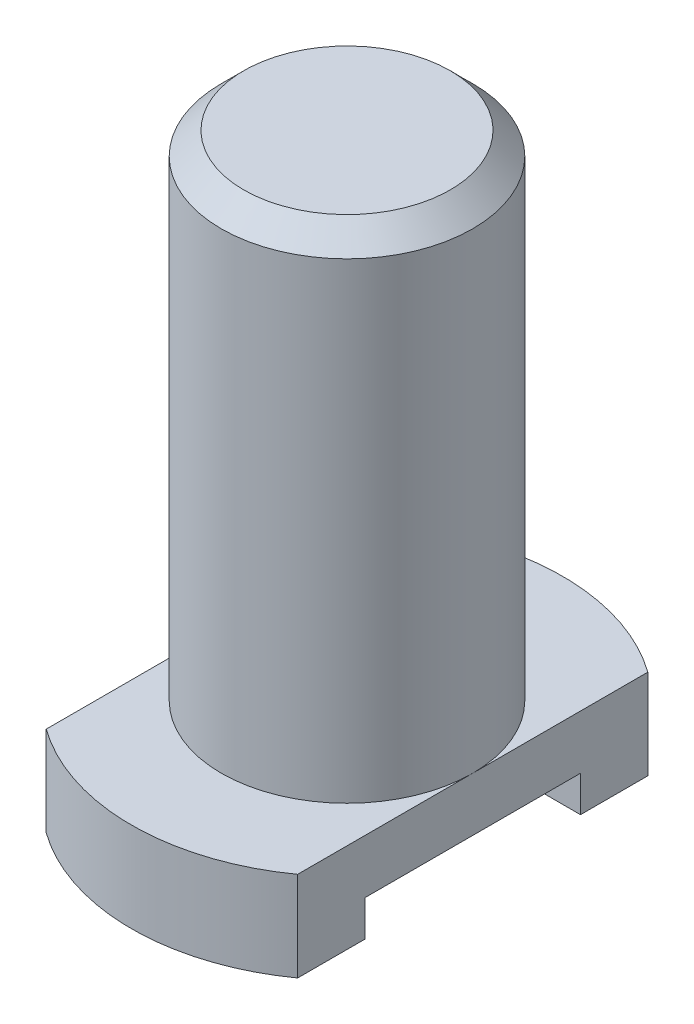
ISO-10303-21;
HEADER;
FILE_DESCRIPTION(('STEP AP214'),'2;1');
FILE_NAME('part.step','',(''),(''),'','','');
FILE_SCHEMA(('AUTOMOTIVE_DESIGN { 1 0 10303 214 1 1 1 1 }'));
ENDSEC;
DATA;
#1=APPLICATION_CONTEXT('core data for automotive mechanical design processes');
#2=APPLICATION_PROTOCOL_DEFINITION('international standard','automotive_design',2000,#1);
#3=PRODUCT_CONTEXT('',#1,'mechanical');
#4=PRODUCT('Part','Part','',(#3));
#5=PRODUCT_RELATED_PRODUCT_CATEGORY('part','',(#4));
#6=PRODUCT_DEFINITION_FORMATION('','',#4);
#7=PRODUCT_DEFINITION_CONTEXT('part definition',#1,'design');
#8=PRODUCT_DEFINITION('design','',#6,#7);
#9=PRODUCT_DEFINITION_SHAPE('','',#8);
#10=(LENGTH_UNIT() NAMED_UNIT(*) SI_UNIT(.MILLI.,.METRE.));
#11=(NAMED_UNIT(*) PLANE_ANGLE_UNIT() SI_UNIT($,.RADIAN.));
#12=(NAMED_UNIT(*) SI_UNIT($,.STERADIAN.) SOLID_ANGLE_UNIT());
#13=UNCERTAINTY_MEASURE_WITH_UNIT(LENGTH_MEASURE(1.E-05),#10,'distance_accuracy_value','');
#14=(GEOMETRIC_REPRESENTATION_CONTEXT(3) GLOBAL_UNCERTAINTY_ASSIGNED_CONTEXT((#13)) GLOBAL_UNIT_ASSIGNED_CONTEXT((#10,
#11,#12)) REPRESENTATION_CONTEXT('',''));
#15=CARTESIAN_POINT('',(0.,0.,0.));
#16=DIRECTION('',(0.,0.,1.));
#17=DIRECTION('',(1.,0.,0.));
#18=AXIS2_PLACEMENT_3D('',#15,#16,#17);
#19=CARTESIAN_POINT('',(0.,0.,0.));
#20=DIRECTION('',(0.,1.,0.));
#21=DIRECTION('',(0.,0.,1.));
#22=AXIS2_PLACEMENT_3D('',#19,#20,#21);
#23=PLANE('',#22);
#24=DIRECTION('',(0.,0.,-1.));
#25=VECTOR('',#24,1.);
#26=CARTESIAN_POINT('',(1.4,0.,0.));
#27=LINE('',#26,#25);
#28=CARTESIAN_POINT('',(1.4,0.,-1.2));
#29=VERTEX_POINT('',#28);
#30=CARTESIAN_POINT('',(1.4,0.,-1.94935886896179));
#31=VERTEX_POINT('',#30);
#32=EDGE_CURVE('E133',#29,#31,#27,.T.);
#33=ORIENTED_EDGE('',*,*,#32,.F.);
#34=DIRECTION('',(-1.,0.,0.));
#35=VECTOR('',#34,1.);
#36=CARTESIAN_POINT('',(0.,0.,-1.2));
#37=LINE('',#36,#35);
#38=CARTESIAN_POINT('',(-1.4,0.,-1.2));
#39=VERTEX_POINT('',#38);
#40=EDGE_CURVE('E43',#29,#39,#37,.T.);
#41=ORIENTED_EDGE('',*,*,#40,.T.);
#42=DIRECTION('',(0.,0.,-1.));
#43=VECTOR('',#42,1.);
#44=CARTESIAN_POINT('',(-1.4,0.,0.));
#45=LINE('',#44,#43);
#46=CARTESIAN_POINT('',(-1.4,0.,-1.94935886896179));
#47=VERTEX_POINT('',#46);
#48=EDGE_CURVE('E149',#39,#47,#45,.T.);
#49=ORIENTED_EDGE('',*,*,#48,.T.);
#50=CARTESIAN_POINT('',(0.,0.,0.));
#51=DIRECTION('',(0.,1.,0.));
#52=DIRECTION('',(0.,0.,1.));
#53=AXIS2_PLACEMENT_3D('',#50,#51,#52);
#54=CIRCLE('',#53,2.4);
#55=EDGE_CURVE('E146',#31,#47,#54,.T.);
#56=ORIENTED_EDGE('',*,*,#55,.F.);
#57=EDGE_LOOP('',(#33,#41,#49,#56));
#58=FACE_BOUND('',#57,.T.);
#59=ADVANCED_FACE('F35',(#58),#23,.F.);
#60=CARTESIAN_POINT('',(0.,6.5,0.));
#61=DIRECTION('',(0.,-1.,0.));
#62=DIRECTION('',(0.,0.,-1.));
#63=AXIS2_PLACEMENT_3D('',#60,#61,#62);
#64=CYLINDRICAL_SURFACE('',#63,1.4);
#65=CARTESIAN_POINT('',(0.,6.25,0.));
#66=DIRECTION('',(0.,1.,0.));
#67=DIRECTION('',(0.,0.,1.));
#68=AXIS2_PLACEMENT_3D('',#65,#66,#67);
#69=CIRCLE('',#68,1.4);
#70=CARTESIAN_POINT('',(0.,6.25,1.4));
#71=VERTEX_POINT('',#70);
#72=EDGE_CURVE('E173',#71,#71,#69,.F.);
#73=ORIENTED_EDGE('',*,*,#72,.T.);
#74=EDGE_LOOP('',(#73));
#75=FACE_BOUND('',#74,.T.);
#76=CARTESIAN_POINT('',(0.,1.,0.));
#77=DIRECTION('',(0.,1.,0.));
#78=DIRECTION('',(0.,0.,1.));
#79=AXIS2_PLACEMENT_3D('',#76,#77,#78);
#80=CIRCLE('',#79,1.4);
#81=CARTESIAN_POINT('',(-1.4,1.,0.));
#82=VERTEX_POINT('',#81);
#83=CARTESIAN_POINT('',(1.4,1.,0.));
#84=VERTEX_POINT('',#83);
#85=EDGE_CURVE('E166',#82,#84,#80,.T.);
#86=ORIENTED_EDGE('',*,*,#85,.T.);
#87=EDGE_CURVE('E169',#84,#82,#80,.T.);
#88=ORIENTED_EDGE('',*,*,#87,.T.);
#89=EDGE_LOOP('',(#86,#88));
#90=FACE_BOUND('',#89,.T.);
#91=ADVANCED_FACE('F193',(#75,#90),#64,.T.);
#92=CARTESIAN_POINT('',(0.,6.5,0.));
#93=DIRECTION('',(0.,1.,0.));
#94=DIRECTION('',(0.,0.,1.));
#95=AXIS2_PLACEMENT_3D('',#92,#93,#94);
#96=PLANE('',#95);
#97=CARTESIAN_POINT('',(0.,6.5,0.));
#98=DIRECTION('',(0.,1.,0.));
#99=DIRECTION('',(0.,0.,1.));
#100=AXIS2_PLACEMENT_3D('',#97,#98,#99);
#101=CIRCLE('',#100,1.15000000000001);
#102=CARTESIAN_POINT('',(0.,6.5,1.15000000000001));
#103=VERTEX_POINT('',#102);
#104=EDGE_CURVE('E170',#103,#103,#101,.T.);
#105=ORIENTED_EDGE('',*,*,#104,.T.);
#106=EDGE_LOOP('',(#105));
#107=FACE_BOUND('',#106,.T.);
#108=ADVANCED_FACE('F219',(#107),#96,.T.);
#109=CARTESIAN_POINT('',(0.,1.,0.));
#110=DIRECTION('',(0.,1.,0.));
#111=DIRECTION('',(0.,0.,1.));
#112=AXIS2_PLACEMENT_3D('',#109,#110,#111);
#113=PLANE('',#112);
#114=ORIENTED_EDGE('',*,*,#87,.F.);
#115=DIRECTION('',(0.,0.,-1.));
#116=VECTOR('',#115,1.);
#117=CARTESIAN_POINT('',(1.4,1.,0.));
#118=LINE('',#117,#116);
#119=CARTESIAN_POINT('',(1.4,1.,-1.94935886896179));
#120=VERTEX_POINT('',#119);
#121=EDGE_CURVE('E136',#84,#120,#118,.T.);
#122=ORIENTED_EDGE('',*,*,#121,.T.);
#123=CARTESIAN_POINT('',(0.,1.,0.));
#124=DIRECTION('',(0.,1.,0.));
#125=DIRECTION('',(0.,0.,1.));
#126=AXIS2_PLACEMENT_3D('',#123,#124,#125);
#127=CIRCLE('',#126,2.4);
#128=CARTESIAN_POINT('',(-1.4,1.,-1.94935886896179));
#129=VERTEX_POINT('',#128);
#130=EDGE_CURVE('E135',#120,#129,#127,.T.);
#131=ORIENTED_EDGE('',*,*,#130,.T.);
#132=DIRECTION('',(0.,0.,-1.));
#133=VECTOR('',#132,1.);
#134=CARTESIAN_POINT('',(-1.4,1.,0.));
#135=LINE('',#134,#133);
#136=EDGE_CURVE('E139',#82,#129,#135,.T.);
#137=ORIENTED_EDGE('',*,*,#136,.F.);
#138=EDGE_LOOP('',(#114,#122,#131,#137));
#139=FACE_BOUND('',#138,.T.);
#140=ADVANCED_FACE('F191',(#139),#113,.T.);
#141=CARTESIAN_POINT('',(1.4,1.,0.));
#142=DIRECTION('',(-1.,0.,0.));
#143=DIRECTION('',(0.,0.,1.));
#144=AXIS2_PLACEMENT_3D('',#141,#142,#143);
#145=PLANE('',#144);
#146=DIRECTION('',(0.,0.,1.));
#147=VECTOR('',#146,1.);
#148=CARTESIAN_POINT('',(1.4,0.4,1.2));
#149=LINE('',#148,#147);
#150=CARTESIAN_POINT('',(1.4,0.4,-1.2));
#151=VERTEX_POINT('',#150);
#152=CARTESIAN_POINT('',(1.4,0.4,1.2));
#153=VERTEX_POINT('',#152);
#154=EDGE_CURVE('E110',#151,#153,#149,.T.);
#155=ORIENTED_EDGE('',*,*,#154,.F.);
#156=DIRECTION('',(0.,1.,0.));
#157=VECTOR('',#156,1.);
#158=CARTESIAN_POINT('',(1.4,-0.4,-1.2));
#159=LINE('',#158,#157);
#160=EDGE_CURVE('E117',#29,#151,#159,.T.);
#161=ORIENTED_EDGE('',*,*,#160,.F.);
#162=ORIENTED_EDGE('',*,*,#32,.T.);
#163=DIRECTION('',(0.,-1.,0.));
#164=VECTOR('',#163,1.);
#165=CARTESIAN_POINT('',(1.4,1.,-1.94935886896179));
#166=LINE('',#165,#164);
#167=EDGE_CURVE('E163',#120,#31,#166,.T.);
#168=ORIENTED_EDGE('',*,*,#167,.F.);
#169=ORIENTED_EDGE('',*,*,#121,.F.);
#170=CARTESIAN_POINT('',(1.4,1.,1.94935886896179));
#171=VERTEX_POINT('',#170);
#172=EDGE_CURVE('E58',#171,#84,#118,.T.);
#173=ORIENTED_EDGE('',*,*,#172,.F.);
#174=DIRECTION('',(0.,-1.,0.));
#175=VECTOR('',#174,1.);
#176=CARTESIAN_POINT('',(1.4,1.,1.94935886896179));
#177=LINE('',#176,#175);
#178=CARTESIAN_POINT('',(1.4,0.,1.94935886896179));
#179=VERTEX_POINT('',#178);
#180=EDGE_CURVE('E154',#171,#179,#177,.T.);
#181=ORIENTED_EDGE('',*,*,#180,.T.);
#182=CARTESIAN_POINT('',(1.4,0.,1.2));
#183=VERTEX_POINT('',#182);
#184=EDGE_CURVE('E144',#179,#183,#27,.T.);
#185=ORIENTED_EDGE('',*,*,#184,.T.);
#186=DIRECTION('',(0.,-1.,0.));
#187=VECTOR('',#186,1.);
#188=CARTESIAN_POINT('',(1.4,-0.4,1.2));
#189=LINE('',#188,#187);
#190=EDGE_CURVE('E50',#153,#183,#189,.T.);
#191=ORIENTED_EDGE('',*,*,#190,.F.);
#192=EDGE_LOOP('',(#155,#161,#162,#168,#169,#173,#181,#185,#191));
#193=FACE_BOUND('',#192,.T.);
#194=ADVANCED_FACE('F123',(#193),#145,.F.);
#195=CARTESIAN_POINT('',(-1.4,1.,0.));
#196=DIRECTION('',(-1.,0.,0.));
#197=DIRECTION('',(0.,0.,1.));
#198=AXIS2_PLACEMENT_3D('',#195,#196,#197);
#199=PLANE('',#198);
#200=DIRECTION('',(0.,-1.,0.));
#201=VECTOR('',#200,1.);
#202=CARTESIAN_POINT('',(-1.4,1.,-1.2));
#203=LINE('',#202,#201);
#204=CARTESIAN_POINT('',(-1.4,0.4,-1.2));
#205=VERTEX_POINT('',#204);
#206=EDGE_CURVE('E131',#205,#39,#203,.T.);
#207=ORIENTED_EDGE('',*,*,#206,.F.);
#208=DIRECTION('',(0.,0.,-1.));
#209=VECTOR('',#208,1.);
#210=CARTESIAN_POINT('',(-1.4,0.4,0.));
#211=LINE('',#210,#209);
#212=CARTESIAN_POINT('',(-1.4,0.4,1.2));
#213=VERTEX_POINT('',#212);
#214=EDGE_CURVE('E11',#213,#205,#211,.T.);
#215=ORIENTED_EDGE('',*,*,#214,.F.);
#216=DIRECTION('',(0.,1.,0.));
#217=VECTOR('',#216,1.);
#218=CARTESIAN_POINT('',(-1.4,1.,1.2));
#219=LINE('',#218,#217);
#220=CARTESIAN_POINT('',(-1.4,0.,1.2));
#221=VERTEX_POINT('',#220);
#222=EDGE_CURVE('E128',#221,#213,#219,.T.);
#223=ORIENTED_EDGE('',*,*,#222,.F.);
#224=CARTESIAN_POINT('',(-1.4,0.,1.94935886896179));
#225=VERTEX_POINT('',#224);
#226=EDGE_CURVE('E151',#225,#221,#45,.T.);
#227=ORIENTED_EDGE('',*,*,#226,.F.);
#228=DIRECTION('',(0.,-1.,0.));
#229=VECTOR('',#228,1.);
#230=CARTESIAN_POINT('',(-1.4,1.,1.94935886896179));
#231=LINE('',#230,#229);
#232=CARTESIAN_POINT('',(-1.4,1.,1.94935886896179));
#233=VERTEX_POINT('',#232);
#234=EDGE_CURVE('E157',#233,#225,#231,.T.);
#235=ORIENTED_EDGE('',*,*,#234,.F.);
#236=EDGE_CURVE('E141',#233,#82,#135,.T.);
#237=ORIENTED_EDGE('',*,*,#236,.T.);
#238=ORIENTED_EDGE('',*,*,#136,.T.);
#239=DIRECTION('',(0.,-1.,0.));
#240=VECTOR('',#239,1.);
#241=CARTESIAN_POINT('',(-1.4,1.,-1.94935886896179));
#242=LINE('',#241,#240);
#243=EDGE_CURVE('E160',#129,#47,#242,.T.);
#244=ORIENTED_EDGE('',*,*,#243,.T.);
#245=ORIENTED_EDGE('',*,*,#48,.F.);
#246=EDGE_LOOP('',(#207,#215,#223,#227,#235,#237,#238,#244,#245));
#247=FACE_BOUND('',#246,.T.);
#248=ADVANCED_FACE('F181',(#247),#199,.T.);
#249=CARTESIAN_POINT('',(0.,1.,0.));
#250=DIRECTION('',(0.,-1.,0.));
#251=DIRECTION('',(0.,0.,-1.));
#252=AXIS2_PLACEMENT_3D('',#249,#250,#251);
#253=CYLINDRICAL_SURFACE('',#252,2.4);
#254=ORIENTED_EDGE('',*,*,#55,.T.);
#255=ORIENTED_EDGE('',*,*,#243,.F.);
#256=ORIENTED_EDGE('',*,*,#130,.F.);
#257=ORIENTED_EDGE('',*,*,#167,.T.);
#258=EDGE_LOOP('',(#254,#255,#256,#257));
#259=FACE_BOUND('',#258,.T.);
#260=ADVANCED_FACE('F186',(#259),#253,.T.);
#261=EDGE_CURVE('E150',#225,#179,#54,.T.);
#262=ORIENTED_EDGE('',*,*,#261,.T.);
#263=ORIENTED_EDGE('',*,*,#180,.F.);
#264=EDGE_CURVE('E140',#233,#171,#127,.T.);
#265=ORIENTED_EDGE('',*,*,#264,.F.);
#266=ORIENTED_EDGE('',*,*,#234,.T.);
#267=EDGE_LOOP('',(#262,#263,#265,#266));
#268=FACE_BOUND('',#267,.T.);
#269=ADVANCED_FACE('F202',(#268),#253,.T.);
#270=ORIENTED_EDGE('',*,*,#85,.F.);
#271=ORIENTED_EDGE('',*,*,#236,.F.);
#272=ORIENTED_EDGE('',*,*,#264,.T.);
#273=ORIENTED_EDGE('',*,*,#172,.T.);
#274=EDGE_LOOP('',(#270,#271,#272,#273));
#275=FACE_BOUND('',#274,.T.);
#276=ADVANCED_FACE('F195',(#275),#113,.T.);
#277=ORIENTED_EDGE('',*,*,#226,.T.);
#278=DIRECTION('',(1.,0.,0.));
#279=VECTOR('',#278,1.);
#280=CARTESIAN_POINT('',(0.,0.,1.2));
#281=LINE('',#280,#279);
#282=EDGE_CURVE('E176',#221,#183,#281,.T.);
#283=ORIENTED_EDGE('',*,*,#282,.T.);
#284=ORIENTED_EDGE('',*,*,#184,.F.);
#285=ORIENTED_EDGE('',*,*,#261,.F.);
#286=EDGE_LOOP('',(#277,#283,#284,#285));
#287=FACE_BOUND('',#286,.T.);
#288=ADVANCED_FACE('F204',(#287),#23,.F.);
#289=CARTESIAN_POINT('',(0.,6.5,0.));
#290=DIRECTION('',(0.,-1.,0.));
#291=DIRECTION('',(0.,0.,-1.));
#292=AXIS2_PLACEMENT_3D('',#289,#290,#291);
#293=CONICAL_SURFACE('',#292,1.15000000000001,0.785398163397443);
#294=ORIENTED_EDGE('',*,*,#72,.F.);
#295=EDGE_LOOP('',(#294));
#296=FACE_BOUND('',#295,.T.);
#297=ORIENTED_EDGE('',*,*,#104,.F.);
#298=EDGE_LOOP('',(#297));
#299=FACE_BOUND('',#298,.T.);
#300=ADVANCED_FACE('F37',(#296,#299),#293,.T.);
#301=CARTESIAN_POINT('',(-2.2,-0.4,-1.2));
#302=DIRECTION('',(0.,0.,-1.));
#303=DIRECTION('',(-1.,0.,0.));
#304=AXIS2_PLACEMENT_3D('',#301,#302,#303);
#305=PLANE('',#304);
#306=ORIENTED_EDGE('',*,*,#206,.T.);
#307=ORIENTED_EDGE('',*,*,#40,.F.);
#308=ORIENTED_EDGE('',*,*,#160,.T.);
#309=DIRECTION('',(1.,0.,0.));
#310=VECTOR('',#309,1.);
#311=CARTESIAN_POINT('',(-2.2,0.4,-1.2));
#312=LINE('',#311,#310);
#313=EDGE_CURVE('E105',#205,#151,#312,.T.);
#314=ORIENTED_EDGE('',*,*,#313,.F.);
#315=EDGE_LOOP('',(#306,#307,#308,#314));
#316=FACE_BOUND('',#315,.T.);
#317=ADVANCED_FACE('F118',(#316),#305,.F.);
#318=CARTESIAN_POINT('',(-2.2,-0.4,1.2));
#319=DIRECTION('',(0.,0.,1.));
#320=DIRECTION('',(1.,0.,0.));
#321=AXIS2_PLACEMENT_3D('',#318,#319,#320);
#322=PLANE('',#321);
#323=ORIENTED_EDGE('',*,*,#222,.T.);
#324=DIRECTION('',(1.,0.,0.));
#325=VECTOR('',#324,1.);
#326=CARTESIAN_POINT('',(-2.2,0.4,1.2));
#327=LINE('',#326,#325);
#328=EDGE_CURVE('E114',#213,#153,#327,.T.);
#329=ORIENTED_EDGE('',*,*,#328,.T.);
#330=ORIENTED_EDGE('',*,*,#190,.T.);
#331=ORIENTED_EDGE('',*,*,#282,.F.);
#332=EDGE_LOOP('',(#323,#329,#330,#331));
#333=FACE_BOUND('',#332,.T.);
#334=ADVANCED_FACE('F205',(#333),#322,.F.);
#335=CARTESIAN_POINT('',(-2.2,0.4,1.2));
#336=DIRECTION('',(0.,1.,0.));
#337=DIRECTION('',(0.,0.,1.));
#338=AXIS2_PLACEMENT_3D('',#335,#336,#337);
#339=PLANE('',#338);
#340=ORIENTED_EDGE('',*,*,#214,.T.);
#341=ORIENTED_EDGE('',*,*,#313,.T.);
#342=ORIENTED_EDGE('',*,*,#154,.T.);
#343=ORIENTED_EDGE('',*,*,#328,.F.);
#344=EDGE_LOOP('',(#340,#341,#342,#343));
#345=FACE_BOUND('',#344,.T.);
#346=ADVANCED_FACE('F107',(#345),#339,.F.);
#347=CLOSED_SHELL('',(#59,#91,#108,#140,#194,#248,#260,#269,#276,#288,#300,#317,#334,#346));
#348=MANIFOLD_SOLID_BREP('B2',#347);
#349=ADVANCED_BREP_SHAPE_REPRESENTATION('',(#18,#348),#14);
#350=SHAPE_DEFINITION_REPRESENTATION(#9,#349);
ENDSEC;
END-ISO-10303-21;
